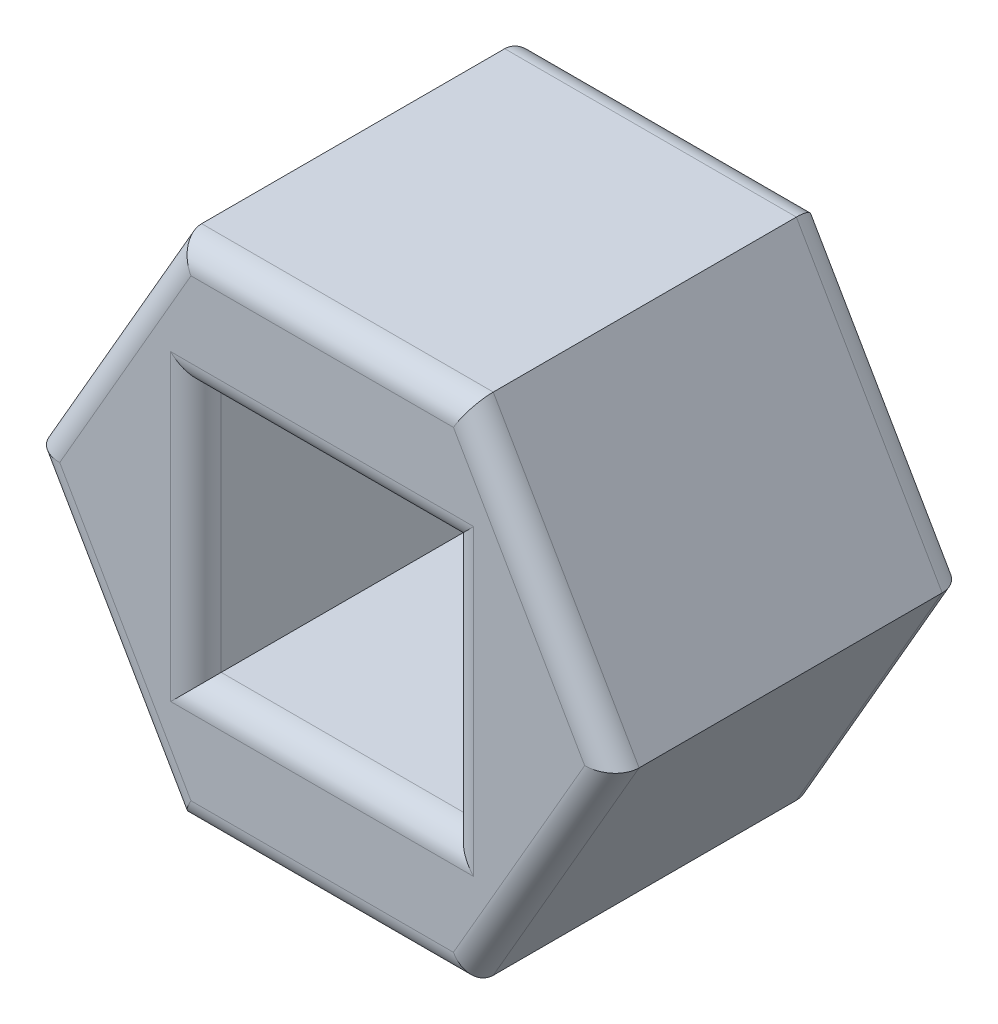
ISO-10303-21;
HEADER;
FILE_DESCRIPTION(('STEP AP214'),'2;1');
FILE_NAME('part.step','',(''),(''),'','','');
FILE_SCHEMA(('AUTOMOTIVE_DESIGN { 1 0 10303 214 1 1 1 1 }'));
ENDSEC;
DATA;
#1=APPLICATION_CONTEXT('core data for automotive mechanical design processes');
#2=APPLICATION_PROTOCOL_DEFINITION('international standard','automotive_design',2000,#1);
#3=PRODUCT_CONTEXT('',#1,'mechanical');
#4=PRODUCT('Part','Part','',(#3));
#5=PRODUCT_RELATED_PRODUCT_CATEGORY('part','',(#4));
#6=PRODUCT_DEFINITION_FORMATION('','',#4);
#7=PRODUCT_DEFINITION_CONTEXT('part definition',#1,'design');
#8=PRODUCT_DEFINITION('design','',#6,#7);
#9=PRODUCT_DEFINITION_SHAPE('','',#8);
#10=(LENGTH_UNIT() NAMED_UNIT(*) SI_UNIT(.MILLI.,.METRE.));
#11=(NAMED_UNIT(*) PLANE_ANGLE_UNIT() SI_UNIT($,.RADIAN.));
#12=(NAMED_UNIT(*) SI_UNIT($,.STERADIAN.) SOLID_ANGLE_UNIT());
#13=UNCERTAINTY_MEASURE_WITH_UNIT(LENGTH_MEASURE(1.E-05),#10,'distance_accuracy_value','');
#14=(GEOMETRIC_REPRESENTATION_CONTEXT(3) GLOBAL_UNCERTAINTY_ASSIGNED_CONTEXT((#13)) GLOBAL_UNIT_ASSIGNED_CONTEXT((#10,
#11,#12)) REPRESENTATION_CONTEXT('',''));
#15=CARTESIAN_POINT('',(0.,0.,0.));
#16=DIRECTION('',(0.,0.,1.));
#17=DIRECTION('',(1.,0.,0.));
#18=AXIS2_PLACEMENT_3D('',#15,#16,#17);
#19=CARTESIAN_POINT('',(0.,0.,8.89));
#20=DIRECTION('',(0.,0.,1.));
#21=DIRECTION('',(1.,0.,0.));
#22=AXIS2_PLACEMENT_3D('',#19,#20,#21);
#23=PLANE('',#22);
#24=DIRECTION('',(1.,0.,0.));
#25=VECTOR('',#24,1.);
#26=CARTESIAN_POINT('',(0.,-3.81,8.89));
#27=LINE('',#26,#25);
#28=CARTESIAN_POINT('',(3.81,-3.81,8.89));
#29=VERTEX_POINT('',#28);
#30=CARTESIAN_POINT('',(-3.81,-3.81,8.89));
#31=VERTEX_POINT('',#30);
#32=EDGE_CURVE('E46',#29,#31,#27,.F.);
#33=ORIENTED_EDGE('',*,*,#32,.T.);
#34=DIRECTION('',(0.,-1.,0.));
#35=VECTOR('',#34,1.);
#36=CARTESIAN_POINT('',(-3.81,0.,8.89));
#37=LINE('',#36,#35);
#38=CARTESIAN_POINT('',(-3.81,3.81,8.89));
#39=VERTEX_POINT('',#38);
#40=EDGE_CURVE('E11',#31,#39,#37,.F.);
#41=ORIENTED_EDGE('',*,*,#40,.T.);
#42=DIRECTION('',(-1.,0.,0.));
#43=VECTOR('',#42,1.);
#44=CARTESIAN_POINT('',(0.,3.81,8.89));
#45=LINE('',#44,#43);
#46=CARTESIAN_POINT('',(3.81,3.81,8.89));
#47=VERTEX_POINT('',#46);
#48=EDGE_CURVE('E270',#39,#47,#45,.F.);
#49=ORIENTED_EDGE('',*,*,#48,.T.);
#50=DIRECTION('',(0.,1.,0.));
#51=VECTOR('',#50,1.);
#52=CARTESIAN_POINT('',(3.81,0.,8.89));
#53=LINE('',#52,#51);
#54=EDGE_CURVE('E57',#47,#29,#53,.F.);
#55=ORIENTED_EDGE('',*,*,#54,.T.);
#56=EDGE_LOOP('',(#33,#41,#49,#55));
#57=FACE_BOUND('',#56,.T.);
#58=DIRECTION('',(0.5,-0.866025403784439,0.));
#59=VECTOR('',#58,1.);
#60=CARTESIAN_POINT('',(-3.116248077951,-6.0325,8.89));
#61=LINE('',#60,#59);
#62=CARTESIAN_POINT('',(-6.59911357683742,0.,8.89));
#63=VERTEX_POINT('',#62);
#64=CARTESIAN_POINT('',(-3.29955678841871,-5.715,8.89));
#65=VERTEX_POINT('',#64);
#66=EDGE_CURVE('E265',#63,#65,#61,.T.);
#67=ORIENTED_EDGE('',*,*,#66,.T.);
#68=DIRECTION('',(1.,0.,0.));
#69=VECTOR('',#68,1.);
#70=CARTESIAN_POINT('',(3.66617420935413,-5.715,8.89));
#71=LINE('',#70,#69);
#72=CARTESIAN_POINT('',(3.29955678841871,-5.715,8.89));
#73=VERTEX_POINT('',#72);
#74=EDGE_CURVE('E267',#65,#73,#71,.T.);
#75=ORIENTED_EDGE('',*,*,#74,.T.);
#76=DIRECTION('',(0.5,0.866025403784439,0.));
#77=VECTOR('',#76,1.);
#78=CARTESIAN_POINT('',(6.78242228730513,0.317499999999998,8.89));
#79=LINE('',#78,#77);
#80=CARTESIAN_POINT('',(6.59911357683742,0.,8.89));
#81=VERTEX_POINT('',#80);
#82=EDGE_CURVE('E257',#73,#81,#79,.T.);
#83=ORIENTED_EDGE('',*,*,#82,.T.);
#84=DIRECTION('',(-0.5,0.866025403784439,0.));
#85=VECTOR('',#84,1.);
#86=CARTESIAN_POINT('',(3.116248077951,6.0325,8.89));
#87=LINE('',#86,#85);
#88=CARTESIAN_POINT('',(3.29955678841871,5.715,8.89));
#89=VERTEX_POINT('',#88);
#90=EDGE_CURVE('E259',#81,#89,#87,.T.);
#91=ORIENTED_EDGE('',*,*,#90,.T.);
#92=DIRECTION('',(-1.,0.,0.));
#93=VECTOR('',#92,1.);
#94=CARTESIAN_POINT('',(-3.66617420935412,5.715,8.89));
#95=LINE('',#94,#93);
#96=CARTESIAN_POINT('',(-3.29955678841871,5.715,8.89));
#97=VERTEX_POINT('',#96);
#98=EDGE_CURVE('E261',#89,#97,#95,.T.);
#99=ORIENTED_EDGE('',*,*,#98,.T.);
#100=DIRECTION('',(-0.5,-0.866025403784439,0.));
#101=VECTOR('',#100,1.);
#102=CARTESIAN_POINT('',(-6.78242228730513,-0.3175,8.89));
#103=LINE('',#102,#101);
#104=EDGE_CURVE('E263',#97,#63,#103,.T.);
#105=ORIENTED_EDGE('',*,*,#104,.T.);
#106=EDGE_LOOP('',(#67,#75,#83,#91,#99,#105));
#107=FACE_BOUND('',#106,.T.);
#108=ADVANCED_FACE('F37',(#57,#107),#23,.T.);
#109=CARTESIAN_POINT('',(0.,0.,0.));
#110=DIRECTION('',(0.,0.,1.));
#111=DIRECTION('',(1.,0.,0.));
#112=AXIS2_PLACEMENT_3D('',#109,#110,#111);
#113=PLANE('',#112);
#114=DIRECTION('',(0.,-1.,0.));
#115=VECTOR('',#114,1.);
#116=CARTESIAN_POINT('',(-3.81,-3.175,0.));
#117=LINE('',#116,#115);
#118=CARTESIAN_POINT('',(-3.81,3.81,0.));
#119=VERTEX_POINT('',#118);
#120=CARTESIAN_POINT('',(-3.81,-3.81,0.));
#121=VERTEX_POINT('',#120);
#122=EDGE_CURVE('E210',#119,#121,#117,.T.);
#123=ORIENTED_EDGE('',*,*,#122,.T.);
#124=DIRECTION('',(1.,0.,0.));
#125=VECTOR('',#124,1.);
#126=CARTESIAN_POINT('',(3.175,-3.81,0.));
#127=LINE('',#126,#125);
#128=CARTESIAN_POINT('',(3.81,-3.81,0.));
#129=VERTEX_POINT('',#128);
#130=EDGE_CURVE('E212',#121,#129,#127,.T.);
#131=ORIENTED_EDGE('',*,*,#130,.T.);
#132=DIRECTION('',(0.,1.,0.));
#133=VECTOR('',#132,1.);
#134=CARTESIAN_POINT('',(3.81,3.175,0.));
#135=LINE('',#134,#133);
#136=CARTESIAN_POINT('',(3.81,3.81,0.));
#137=VERTEX_POINT('',#136);
#138=EDGE_CURVE('E201',#129,#137,#135,.T.);
#139=ORIENTED_EDGE('',*,*,#138,.T.);
#140=DIRECTION('',(-1.,0.,0.));
#141=VECTOR('',#140,1.);
#142=CARTESIAN_POINT('',(-3.175,3.81,0.));
#143=LINE('',#142,#141);
#144=EDGE_CURVE('E203',#137,#119,#143,.T.);
#145=ORIENTED_EDGE('',*,*,#144,.T.);
#146=EDGE_LOOP('',(#123,#131,#139,#145));
#147=FACE_BOUND('',#146,.T.);
#148=DIRECTION('',(-1.,0.,0.));
#149=VECTOR('',#148,1.);
#150=CARTESIAN_POINT('',(0.,5.715,0.));
#151=LINE('',#150,#149);
#152=CARTESIAN_POINT('',(-3.29955678841871,5.715,0.));
#153=VERTEX_POINT('',#152);
#154=CARTESIAN_POINT('',(3.29955678841871,5.715,0.));
#155=VERTEX_POINT('',#154);
#156=EDGE_CURVE('E200',#153,#155,#151,.F.);
#157=ORIENTED_EDGE('',*,*,#156,.T.);
#158=DIRECTION('',(-0.5,0.866025403784439,0.));
#159=VECTOR('',#158,1.);
#160=CARTESIAN_POINT('',(4.94933518262806,2.8575,0.));
#161=LINE('',#160,#159);
#162=CARTESIAN_POINT('',(6.59911357683742,0.,0.));
#163=VERTEX_POINT('',#162);
#164=EDGE_CURVE('E179',#155,#163,#161,.F.);
#165=ORIENTED_EDGE('',*,*,#164,.T.);
#166=DIRECTION('',(0.5,0.866025403784439,0.));
#167=VECTOR('',#166,1.);
#168=CARTESIAN_POINT('',(4.94933518262807,-2.8575,0.));
#169=LINE('',#168,#167);
#170=CARTESIAN_POINT('',(3.29955678841872,-5.715,0.));
#171=VERTEX_POINT('',#170);
#172=EDGE_CURVE('E189',#163,#171,#169,.F.);
#173=ORIENTED_EDGE('',*,*,#172,.T.);
#174=DIRECTION('',(1.,0.,0.));
#175=VECTOR('',#174,1.);
#176=CARTESIAN_POINT('',(0.,-5.715,0.));
#177=LINE('',#176,#175);
#178=CARTESIAN_POINT('',(-3.29955678841871,-5.715,0.));
#179=VERTEX_POINT('',#178);
#180=EDGE_CURVE('E195',#171,#179,#177,.F.);
#181=ORIENTED_EDGE('',*,*,#180,.T.);
#182=DIRECTION('',(0.5,-0.866025403784439,0.));
#183=VECTOR('',#182,1.);
#184=CARTESIAN_POINT('',(-4.94933518262806,-2.8575,0.));
#185=LINE('',#184,#183);
#186=CARTESIAN_POINT('',(-6.59911357683742,0.,0.));
#187=VERTEX_POINT('',#186);
#188=EDGE_CURVE('E349',#179,#187,#185,.F.);
#189=ORIENTED_EDGE('',*,*,#188,.T.);
#190=DIRECTION('',(-0.5,-0.866025403784439,0.));
#191=VECTOR('',#190,1.);
#192=CARTESIAN_POINT('',(-4.94933518262807,2.8575,0.));
#193=LINE('',#192,#191);
#194=EDGE_CURVE('E205',#187,#153,#193,.F.);
#195=ORIENTED_EDGE('',*,*,#194,.T.);
#196=EDGE_LOOP('',(#157,#165,#173,#181,#189,#195));
#197=FACE_BOUND('',#196,.T.);
#198=ADVANCED_FACE('F198',(#147,#197),#113,.F.);
#199=CARTESIAN_POINT('',(3.66617420935413,-6.35,8.89));
#200=DIRECTION('',(-0.866025403784439,0.5,0.));
#201=DIRECTION('',(-0.5,-0.866025403784439,0.));
#202=AXIS2_PLACEMENT_3D('',#199,#200,#201);
#203=PLANE('',#202);
#204=DIRECTION('',(0.,0.,-1.));
#205=VECTOR('',#204,1.);
#206=CARTESIAN_POINT('',(3.66617420935413,-6.35,8.89));
#207=LINE('',#206,#205);
#208=CARTESIAN_POINT('',(3.66617420935413,-6.35,8.255));
#209=VERTEX_POINT('',#208);
#210=CARTESIAN_POINT('',(3.66617420935413,-6.35,0.635));
#211=VERTEX_POINT('',#210);
#212=EDGE_CURVE('E368',#209,#211,#207,.T.);
#213=ORIENTED_EDGE('',*,*,#212,.T.);
#214=DIRECTION('',(0.5,0.866025403784439,0.));
#215=VECTOR('',#214,1.);
#216=CARTESIAN_POINT('',(3.66617420935413,-6.35,0.635));
#217=LINE('',#216,#215);
#218=CARTESIAN_POINT('',(7.33234841870825,0.,0.635));
#219=VERTEX_POINT('',#218);
#220=EDGE_CURVE('E255',#211,#219,#217,.T.);
#221=ORIENTED_EDGE('',*,*,#220,.T.);
#222=DIRECTION('',(0.,0.,-1.));
#223=VECTOR('',#222,1.);
#224=CARTESIAN_POINT('',(7.33234841870825,0.,8.89));
#225=LINE('',#224,#223);
#226=CARTESIAN_POINT('',(7.33234841870825,0.,8.255));
#227=VERTEX_POINT('',#226);
#228=EDGE_CURVE('E196',#227,#219,#225,.T.);
#229=ORIENTED_EDGE('',*,*,#228,.F.);
#230=DIRECTION('',(0.5,0.866025403784439,0.));
#231=VECTOR('',#230,1.);
#232=CARTESIAN_POINT('',(3.66617420935413,-6.35,8.255));
#233=LINE('',#232,#231);
#234=EDGE_CURVE('E253',#227,#209,#233,.F.);
#235=ORIENTED_EDGE('',*,*,#234,.T.);
#236=EDGE_LOOP('',(#213,#221,#229,#235));
#237=FACE_BOUND('',#236,.T.);
#238=ADVANCED_FACE('F433',(#237),#203,.F.);
#239=CARTESIAN_POINT('',(7.33234841870825,0.,8.89));
#240=DIRECTION('',(-0.866025403784438,-0.5,0.));
#241=DIRECTION('',(0.5,-0.866025403784439,0.));
#242=AXIS2_PLACEMENT_3D('',#239,#240,#241);
#243=PLANE('',#242);
#244=ORIENTED_EDGE('',*,*,#228,.T.);
#245=DIRECTION('',(-0.5,0.866025403784439,0.));
#246=VECTOR('',#245,1.);
#247=CARTESIAN_POINT('',(7.33234841870825,0.,0.635));
#248=LINE('',#247,#246);
#249=CARTESIAN_POINT('',(3.66617420935412,6.35,0.635));
#250=VERTEX_POINT('',#249);
#251=EDGE_CURVE('E182',#219,#250,#248,.T.);
#252=ORIENTED_EDGE('',*,*,#251,.T.);
#253=DIRECTION('',(0.,0.,-1.));
#254=VECTOR('',#253,1.);
#255=CARTESIAN_POINT('',(3.66617420935412,6.35,8.89));
#256=LINE('',#255,#254);
#257=CARTESIAN_POINT('',(3.66617420935412,6.35,8.255));
#258=VERTEX_POINT('',#257);
#259=EDGE_CURVE('E335',#258,#250,#256,.T.);
#260=ORIENTED_EDGE('',*,*,#259,.F.);
#261=DIRECTION('',(-0.5,0.866025403784439,0.));
#262=VECTOR('',#261,1.);
#263=CARTESIAN_POINT('',(7.33234841870825,0.,8.255));
#264=LINE('',#263,#262);
#265=EDGE_CURVE('E233',#258,#227,#264,.F.);
#266=ORIENTED_EDGE('',*,*,#265,.T.);
#267=EDGE_LOOP('',(#244,#252,#260,#266));
#268=FACE_BOUND('',#267,.T.);
#269=ADVANCED_FACE('F340',(#268),#243,.F.);
#270=CARTESIAN_POINT('',(3.66617420935412,6.35,8.89));
#271=DIRECTION('',(0.,-1.,0.));
#272=DIRECTION('',(0.,0.,-1.));
#273=AXIS2_PLACEMENT_3D('',#270,#271,#272);
#274=PLANE('',#273);
#275=ORIENTED_EDGE('',*,*,#259,.T.);
#276=DIRECTION('',(-1.,0.,0.));
#277=VECTOR('',#276,1.);
#278=CARTESIAN_POINT('',(3.66617420935412,6.35,0.635));
#279=LINE('',#278,#277);
#280=CARTESIAN_POINT('',(-3.66617420935412,6.35,0.635));
#281=VERTEX_POINT('',#280);
#282=EDGE_CURVE('E238',#250,#281,#279,.T.);
#283=ORIENTED_EDGE('',*,*,#282,.T.);
#284=DIRECTION('',(0.,0.,-1.));
#285=VECTOR('',#284,1.);
#286=CARTESIAN_POINT('',(-3.66617420935412,6.35,8.89));
#287=LINE('',#286,#285);
#288=CARTESIAN_POINT('',(-3.66617420935412,6.35,8.255));
#289=VERTEX_POINT('',#288);
#290=EDGE_CURVE('E337',#289,#281,#287,.T.);
#291=ORIENTED_EDGE('',*,*,#290,.F.);
#292=DIRECTION('',(-1.,0.,0.));
#293=VECTOR('',#292,1.);
#294=CARTESIAN_POINT('',(3.66617420935412,6.35,8.255));
#295=LINE('',#294,#293);
#296=EDGE_CURVE('E236',#289,#258,#295,.F.);
#297=ORIENTED_EDGE('',*,*,#296,.T.);
#298=EDGE_LOOP('',(#275,#283,#291,#297));
#299=FACE_BOUND('',#298,.T.);
#300=ADVANCED_FACE('F334',(#299),#274,.F.);
#301=CARTESIAN_POINT('',(-3.66617420935412,6.35,8.89));
#302=DIRECTION('',(0.866025403784439,-0.5,0.));
#303=DIRECTION('',(0.5,0.866025403784439,0.));
#304=AXIS2_PLACEMENT_3D('',#301,#302,#303);
#305=PLANE('',#304);
#306=ORIENTED_EDGE('',*,*,#290,.T.);
#307=DIRECTION('',(-0.5,-0.866025403784439,0.));
#308=VECTOR('',#307,1.);
#309=CARTESIAN_POINT('',(-3.66617420935412,6.35,0.635));
#310=LINE('',#309,#308);
#311=CARTESIAN_POINT('',(-7.33234841870825,0.,0.635));
#312=VERTEX_POINT('',#311);
#313=EDGE_CURVE('E242',#281,#312,#310,.T.);
#314=ORIENTED_EDGE('',*,*,#313,.T.);
#315=DIRECTION('',(0.,0.,-1.));
#316=VECTOR('',#315,1.);
#317=CARTESIAN_POINT('',(-7.33234841870825,0.,8.89));
#318=LINE('',#317,#316);
#319=CARTESIAN_POINT('',(-7.33234841870825,0.,8.255));
#320=VERTEX_POINT('',#319);
#321=EDGE_CURVE('E344',#320,#312,#318,.T.);
#322=ORIENTED_EDGE('',*,*,#321,.F.);
#323=DIRECTION('',(-0.5,-0.866025403784439,0.));
#324=VECTOR('',#323,1.);
#325=CARTESIAN_POINT('',(-3.66617420935412,6.35,8.255));
#326=LINE('',#325,#324);
#327=EDGE_CURVE('E240',#320,#289,#326,.F.);
#328=ORIENTED_EDGE('',*,*,#327,.T.);
#329=EDGE_LOOP('',(#306,#314,#322,#328));
#330=FACE_BOUND('',#329,.T.);
#331=ADVANCED_FACE('F361',(#330),#305,.F.);
#332=CARTESIAN_POINT('',(-7.33234841870825,0.,8.89));
#333=DIRECTION('',(0.866025403784439,0.5,0.));
#334=DIRECTION('',(-0.5,0.866025403784439,0.));
#335=AXIS2_PLACEMENT_3D('',#332,#333,#334);
#336=PLANE('',#335);
#337=ORIENTED_EDGE('',*,*,#321,.T.);
#338=DIRECTION('',(0.5,-0.866025403784439,0.));
#339=VECTOR('',#338,1.);
#340=CARTESIAN_POINT('',(-7.33234841870825,0.,0.635));
#341=LINE('',#340,#339);
#342=CARTESIAN_POINT('',(-3.66617420935412,-6.35,0.635));
#343=VERTEX_POINT('',#342);
#344=EDGE_CURVE('E246',#312,#343,#341,.T.);
#345=ORIENTED_EDGE('',*,*,#344,.T.);
#346=DIRECTION('',(0.,0.,-1.));
#347=VECTOR('',#346,1.);
#348=CARTESIAN_POINT('',(-3.66617420935412,-6.35,8.89));
#349=LINE('',#348,#347);
#350=CARTESIAN_POINT('',(-3.66617420935412,-6.35,8.255));
#351=VERTEX_POINT('',#350);
#352=EDGE_CURVE('E366',#351,#343,#349,.T.);
#353=ORIENTED_EDGE('',*,*,#352,.F.);
#354=DIRECTION('',(0.5,-0.866025403784439,0.));
#355=VECTOR('',#354,1.);
#356=CARTESIAN_POINT('',(-7.33234841870825,0.,8.255));
#357=LINE('',#356,#355);
#358=EDGE_CURVE('E244',#351,#320,#357,.F.);
#359=ORIENTED_EDGE('',*,*,#358,.T.);
#360=EDGE_LOOP('',(#337,#345,#353,#359));
#361=FACE_BOUND('',#360,.T.);
#362=ADVANCED_FACE('F443',(#361),#336,.F.);
#363=CARTESIAN_POINT('',(-3.66617420935412,-6.35,8.89));
#364=DIRECTION('',(0.,1.,0.));
#365=DIRECTION('',(-1.,0.,0.));
#366=AXIS2_PLACEMENT_3D('',#363,#364,#365);
#367=PLANE('',#366);
#368=ORIENTED_EDGE('',*,*,#352,.T.);
#369=DIRECTION('',(1.,0.,0.));
#370=VECTOR('',#369,1.);
#371=CARTESIAN_POINT('',(-3.66617420935412,-6.35,0.635));
#372=LINE('',#371,#370);
#373=EDGE_CURVE('E251',#343,#211,#372,.T.);
#374=ORIENTED_EDGE('',*,*,#373,.T.);
#375=ORIENTED_EDGE('',*,*,#212,.F.);
#376=DIRECTION('',(1.,0.,0.));
#377=VECTOR('',#376,1.);
#378=CARTESIAN_POINT('',(-3.66617420935412,-6.35,8.255));
#379=LINE('',#378,#377);
#380=EDGE_CURVE('E248',#209,#351,#379,.F.);
#381=ORIENTED_EDGE('',*,*,#380,.T.);
#382=EDGE_LOOP('',(#368,#374,#375,#381));
#383=FACE_BOUND('',#382,.T.);
#384=ADVANCED_FACE('F440',(#383),#367,.F.);
#385=CARTESIAN_POINT('',(3.175,-3.175,8.89));
#386=DIRECTION('',(-1.,0.,0.));
#387=DIRECTION('',(0.,0.,1.));
#388=AXIS2_PLACEMENT_3D('',#385,#386,#387);
#389=PLANE('',#388);
#390=DIRECTION('',(0.,0.,-1.));
#391=VECTOR('',#390,1.);
#392=CARTESIAN_POINT('',(3.175,3.175,8.89));
#393=LINE('',#392,#391);
#394=CARTESIAN_POINT('',(3.175,3.175,8.255));
#395=VERTEX_POINT('',#394);
#396=CARTESIAN_POINT('',(3.175,3.175,0.635));
#397=VERTEX_POINT('',#396);
#398=EDGE_CURVE('E373',#395,#397,#393,.T.);
#399=ORIENTED_EDGE('',*,*,#398,.T.);
#400=DIRECTION('',(0.,1.,0.));
#401=VECTOR('',#400,1.);
#402=CARTESIAN_POINT('',(3.175,-3.175,0.635));
#403=LINE('',#402,#401);
#404=CARTESIAN_POINT('',(3.175,-3.175,0.635));
#405=VERTEX_POINT('',#404);
#406=EDGE_CURVE('E231',#397,#405,#403,.F.);
#407=ORIENTED_EDGE('',*,*,#406,.T.);
#408=DIRECTION('',(0.,0.,-1.));
#409=VECTOR('',#408,1.);
#410=CARTESIAN_POINT('',(3.175,-3.175,8.89));
#411=LINE('',#410,#409);
#412=CARTESIAN_POINT('',(3.175,-3.175,8.255));
#413=VERTEX_POINT('',#412);
#414=EDGE_CURVE('E285',#413,#405,#411,.T.);
#415=ORIENTED_EDGE('',*,*,#414,.F.);
#416=DIRECTION('',(0.,1.,0.));
#417=VECTOR('',#416,1.);
#418=CARTESIAN_POINT('',(3.175,-3.175,8.255));
#419=LINE('',#418,#417);
#420=EDGE_CURVE('E229',#413,#395,#419,.T.);
#421=ORIENTED_EDGE('',*,*,#420,.T.);
#422=EDGE_LOOP('',(#399,#407,#415,#421));
#423=FACE_BOUND('',#422,.T.);
#424=ADVANCED_FACE('F437',(#423),#389,.T.);
#425=CARTESIAN_POINT('',(-3.175,3.175,8.89));
#426=DIRECTION('',(0.,-1.,0.));
#427=DIRECTION('',(0.,0.,-1.));
#428=AXIS2_PLACEMENT_3D('',#425,#426,#427);
#429=PLANE('',#428);
#430=DIRECTION('',(0.,0.,-1.));
#431=VECTOR('',#430,1.);
#432=CARTESIAN_POINT('',(-3.175,3.175,8.89));
#433=LINE('',#432,#431);
#434=CARTESIAN_POINT('',(-3.175,3.175,8.255));
#435=VERTEX_POINT('',#434);
#436=CARTESIAN_POINT('',(-3.175,3.175,0.635));
#437=VERTEX_POINT('',#436);
#438=EDGE_CURVE('E376',#435,#437,#433,.T.);
#439=ORIENTED_EDGE('',*,*,#438,.T.);
#440=DIRECTION('',(-1.,0.,0.));
#441=VECTOR('',#440,1.);
#442=CARTESIAN_POINT('',(3.175,3.175,0.635));
#443=LINE('',#442,#441);
#444=EDGE_CURVE('E227',#437,#397,#443,.F.);
#445=ORIENTED_EDGE('',*,*,#444,.T.);
#446=ORIENTED_EDGE('',*,*,#398,.F.);
#447=DIRECTION('',(-1.,0.,0.));
#448=VECTOR('',#447,1.);
#449=CARTESIAN_POINT('',(-3.175,3.175,8.255));
#450=LINE('',#449,#448);
#451=EDGE_CURVE('E225',#395,#435,#450,.T.);
#452=ORIENTED_EDGE('',*,*,#451,.T.);
#453=EDGE_LOOP('',(#439,#445,#446,#452));
#454=FACE_BOUND('',#453,.T.);
#455=ADVANCED_FACE('F414',(#454),#429,.T.);
#456=CARTESIAN_POINT('',(-3.175,-3.175,8.89));
#457=DIRECTION('',(1.,0.,0.));
#458=DIRECTION('',(0.,0.,-1.));
#459=AXIS2_PLACEMENT_3D('',#456,#457,#458);
#460=PLANE('',#459);
#461=DIRECTION('',(0.,0.,-1.));
#462=VECTOR('',#461,1.);
#463=CARTESIAN_POINT('',(-3.175,-3.175,8.89));
#464=LINE('',#463,#462);
#465=CARTESIAN_POINT('',(-3.175,-3.175,8.255));
#466=VERTEX_POINT('',#465);
#467=CARTESIAN_POINT('',(-3.175,-3.175,0.635));
#468=VERTEX_POINT('',#467);
#469=EDGE_CURVE('E379',#466,#468,#464,.T.);
#470=ORIENTED_EDGE('',*,*,#469,.T.);
#471=DIRECTION('',(0.,-1.,0.));
#472=VECTOR('',#471,1.);
#473=CARTESIAN_POINT('',(-3.175,3.175,0.635));
#474=LINE('',#473,#472);
#475=EDGE_CURVE('E223',#468,#437,#474,.F.);
#476=ORIENTED_EDGE('',*,*,#475,.T.);
#477=ORIENTED_EDGE('',*,*,#438,.F.);
#478=DIRECTION('',(0.,-1.,0.));
#479=VECTOR('',#478,1.);
#480=CARTESIAN_POINT('',(-3.175,-3.175,8.255));
#481=LINE('',#480,#479);
#482=EDGE_CURVE('E220',#435,#466,#481,.T.);
#483=ORIENTED_EDGE('',*,*,#482,.T.);
#484=EDGE_LOOP('',(#470,#476,#477,#483));
#485=FACE_BOUND('',#484,.T.);
#486=ADVANCED_FACE('F410',(#485),#460,.T.);
#487=CARTESIAN_POINT('',(-3.175,-3.175,8.89));
#488=DIRECTION('',(0.,1.,0.));
#489=DIRECTION('',(0.,0.,1.));
#490=AXIS2_PLACEMENT_3D('',#487,#488,#489);
#491=PLANE('',#490);
#492=ORIENTED_EDGE('',*,*,#414,.T.);
#493=DIRECTION('',(1.,0.,0.));
#494=VECTOR('',#493,1.);
#495=CARTESIAN_POINT('',(-3.175,-3.175,0.635));
#496=LINE('',#495,#494);
#497=EDGE_CURVE('E217',#405,#468,#496,.F.);
#498=ORIENTED_EDGE('',*,*,#497,.T.);
#499=ORIENTED_EDGE('',*,*,#469,.F.);
#500=DIRECTION('',(1.,0.,0.));
#501=VECTOR('',#500,1.);
#502=CARTESIAN_POINT('',(-3.175,-3.175,8.255));
#503=LINE('',#502,#501);
#504=EDGE_CURVE('E215',#466,#413,#503,.T.);
#505=ORIENTED_EDGE('',*,*,#504,.T.);
#506=EDGE_LOOP('',(#492,#498,#499,#505));
#507=FACE_BOUND('',#506,.T.);
#508=ADVANCED_FACE('F386',(#507),#491,.T.);
#509=CARTESIAN_POINT('',(0.,3.81,0.635));
#510=DIRECTION('',(1.,0.,0.));
#511=DIRECTION('',(0.,0.,-1.));
#512=AXIS2_PLACEMENT_3D('',#509,#510,#511);
#513=CYLINDRICAL_SURFACE('',#512,0.635);
#514=CARTESIAN_POINT('',(3.81,3.81,0.635));
#515=DIRECTION('',(0.707106781186547,-0.707106781186547,0.));
#516=DIRECTION('',(0.707106781186547,0.707106781186547,0.));
#517=AXIS2_PLACEMENT_3D('',#514,#515,#516);
#518=ELLIPSE('',#517,0.898025612106915,0.635);
#519=EDGE_CURVE('E279',#397,#137,#518,.T.);
#520=ORIENTED_EDGE('',*,*,#519,.F.);
#521=ORIENTED_EDGE('',*,*,#444,.F.);
#522=CARTESIAN_POINT('',(-3.81,3.81,0.635));
#523=DIRECTION('',(0.707106781186547,0.707106781186547,0.));
#524=DIRECTION('',(-0.707106781186547,0.707106781186547,0.));
#525=AXIS2_PLACEMENT_3D('',#522,#523,#524);
#526=ELLIPSE('',#525,0.898025612106915,0.635);
#527=EDGE_CURVE('E282',#119,#437,#526,.F.);
#528=ORIENTED_EDGE('',*,*,#527,.F.);
#529=ORIENTED_EDGE('',*,*,#144,.F.);
#530=EDGE_LOOP('',(#520,#521,#528,#529));
#531=FACE_BOUND('',#530,.T.);
#532=ADVANCED_FACE('F418',(#531),#513,.T.);
#533=CARTESIAN_POINT('',(-3.81,0.,0.635));
#534=DIRECTION('',(0.,1.,0.));
#535=DIRECTION('',(0.,0.,1.));
#536=AXIS2_PLACEMENT_3D('',#533,#534,#535);
#537=CYLINDRICAL_SURFACE('',#536,0.635);
#538=ORIENTED_EDGE('',*,*,#527,.T.);
#539=ORIENTED_EDGE('',*,*,#475,.F.);
#540=CARTESIAN_POINT('',(-3.81,-3.81,0.635));
#541=DIRECTION('',(-0.707106781186547,0.707106781186547,0.));
#542=DIRECTION('',(-0.707106781186547,-0.707106781186547,0.));
#543=AXIS2_PLACEMENT_3D('',#540,#541,#542);
#544=ELLIPSE('',#543,0.898025612106915,0.635);
#545=EDGE_CURVE('E276',#121,#468,#544,.F.);
#546=ORIENTED_EDGE('',*,*,#545,.F.);
#547=ORIENTED_EDGE('',*,*,#122,.F.);
#548=EDGE_LOOP('',(#538,#539,#546,#547));
#549=FACE_BOUND('',#548,.T.);
#550=ADVANCED_FACE('F407',(#549),#537,.T.);
#551=CARTESIAN_POINT('',(3.81,0.,0.635));
#552=DIRECTION('',(0.,-1.,0.));
#553=DIRECTION('',(0.,0.,-1.));
#554=AXIS2_PLACEMENT_3D('',#551,#552,#553);
#555=CYLINDRICAL_SURFACE('',#554,0.635);
#556=ORIENTED_EDGE('',*,*,#519,.T.);
#557=ORIENTED_EDGE('',*,*,#138,.F.);
#558=CARTESIAN_POINT('',(3.81,-3.81,0.635));
#559=DIRECTION('',(-0.707106781186547,-0.707106781186547,0.));
#560=DIRECTION('',(-0.707106781186547,0.707106781186547,0.));
#561=AXIS2_PLACEMENT_3D('',#558,#559,#560);
#562=ELLIPSE('',#561,0.898025612106915,0.635);
#563=EDGE_CURVE('E274',#405,#129,#562,.T.);
#564=ORIENTED_EDGE('',*,*,#563,.F.);
#565=ORIENTED_EDGE('',*,*,#406,.F.);
#566=EDGE_LOOP('',(#556,#557,#564,#565));
#567=FACE_BOUND('',#566,.T.);
#568=ADVANCED_FACE('F400',(#567),#555,.T.);
#569=CARTESIAN_POINT('',(0.,-3.81,0.635));
#570=DIRECTION('',(-1.,0.,0.));
#571=DIRECTION('',(0.,0.,1.));
#572=AXIS2_PLACEMENT_3D('',#569,#570,#571);
#573=CYLINDRICAL_SURFACE('',#572,0.635);
#574=ORIENTED_EDGE('',*,*,#545,.T.);
#575=ORIENTED_EDGE('',*,*,#497,.F.);
#576=ORIENTED_EDGE('',*,*,#563,.T.);
#577=ORIENTED_EDGE('',*,*,#130,.F.);
#578=EDGE_LOOP('',(#574,#575,#576,#577));
#579=FACE_BOUND('',#578,.T.);
#580=ADVANCED_FACE('F393',(#579),#573,.T.);
#581=CARTESIAN_POINT('',(-6.78242228730513,0.317500000000001,0.635));
#582=DIRECTION('',(0.5,-0.866025403784439,0.));
#583=DIRECTION('',(0.866025403784439,0.5,0.));
#584=AXIS2_PLACEMENT_3D('',#581,#582,#583);
#585=CYLINDRICAL_SURFACE('',#584,0.635);
#586=CARTESIAN_POINT('',(-6.59911357683742,0.,0.635));
#587=DIRECTION('',(0.,-1.,0.));
#588=DIRECTION('',(1.,0.,0.));
#589=AXIS2_PLACEMENT_3D('',#586,#587,#588);
#590=ELLIPSE('',#589,0.733234841870825,0.635);
#591=EDGE_CURVE('E291',#187,#312,#590,.F.);
#592=ORIENTED_EDGE('',*,*,#591,.F.);
#593=ORIENTED_EDGE('',*,*,#188,.F.);
#594=CARTESIAN_POINT('',(-3.29955678841871,-5.715,0.635));
#595=DIRECTION('',(0.866025403784439,-0.5,0.));
#596=DIRECTION('',(0.5,0.866025403784439,0.));
#597=AXIS2_PLACEMENT_3D('',#594,#595,#596);
#598=ELLIPSE('',#597,0.733234841870825,0.635);
#599=EDGE_CURVE('E277',#343,#179,#598,.T.);
#600=ORIENTED_EDGE('',*,*,#599,.F.);
#601=ORIENTED_EDGE('',*,*,#344,.F.);
#602=EDGE_LOOP('',(#592,#593,#600,#601));
#603=FACE_BOUND('',#602,.T.);
#604=ADVANCED_FACE('F458',(#603),#585,.T.);
#605=CARTESIAN_POINT('',(-3.66617420935412,-5.715,0.635));
#606=DIRECTION('',(1.,0.,0.));
#607=DIRECTION('',(0.,1.,0.));
#608=AXIS2_PLACEMENT_3D('',#605,#606,#607);
#609=CYLINDRICAL_SURFACE('',#608,0.635);
#610=ORIENTED_EDGE('',*,*,#599,.T.);
#611=ORIENTED_EDGE('',*,*,#180,.F.);
#612=CARTESIAN_POINT('',(3.29955678841872,-5.715,0.635));
#613=DIRECTION('',(0.866025403784439,0.5,0.));
#614=DIRECTION('',(-0.5,0.866025403784439,0.));
#615=AXIS2_PLACEMENT_3D('',#612,#613,#614);
#616=ELLIPSE('',#615,0.733234841870825,0.635);
#617=EDGE_CURVE('E192',#211,#171,#616,.T.);
#618=ORIENTED_EDGE('',*,*,#617,.F.);
#619=ORIENTED_EDGE('',*,*,#373,.F.);
#620=EDGE_LOOP('',(#610,#611,#618,#619));
#621=FACE_BOUND('',#620,.T.);
#622=ADVANCED_FACE('F474',(#621),#609,.T.);
#623=CARTESIAN_POINT('',(-3.116248077951,6.0325,0.635));
#624=DIRECTION('',(-0.5,-0.866025403784439,0.));
#625=DIRECTION('',(0.866025403784439,-0.5,0.));
#626=AXIS2_PLACEMENT_3D('',#623,#624,#625);
#627=CYLINDRICAL_SURFACE('',#626,0.635);
#628=ORIENTED_EDGE('',*,*,#591,.T.);
#629=ORIENTED_EDGE('',*,*,#313,.F.);
#630=CARTESIAN_POINT('',(-3.29955678841871,5.715,0.635));
#631=DIRECTION('',(-0.866025403784439,-0.5,0.));
#632=DIRECTION('',(0.5,-0.866025403784439,0.));
#633=AXIS2_PLACEMENT_3D('',#630,#631,#632);
#634=ELLIPSE('',#633,0.733234841870825,0.635);
#635=EDGE_CURVE('E185',#153,#281,#634,.F.);
#636=ORIENTED_EDGE('',*,*,#635,.F.);
#637=ORIENTED_EDGE('',*,*,#194,.F.);
#638=EDGE_LOOP('',(#628,#629,#636,#637));
#639=FACE_BOUND('',#638,.T.);
#640=ADVANCED_FACE('F356',(#639),#627,.T.);
#641=CARTESIAN_POINT('',(3.11624807795101,-6.0325,0.635));
#642=DIRECTION('',(0.5,0.866025403784439,0.));
#643=DIRECTION('',(-0.866025403784439,0.5,0.));
#644=AXIS2_PLACEMENT_3D('',#641,#642,#643);
#645=CYLINDRICAL_SURFACE('',#644,0.635);
#646=ORIENTED_EDGE('',*,*,#617,.T.);
#647=ORIENTED_EDGE('',*,*,#172,.F.);
#648=CARTESIAN_POINT('',(6.59911357683742,0.,0.635));
#649=DIRECTION('',(0.,1.,0.));
#650=DIRECTION('',(1.,0.,0.));
#651=AXIS2_PLACEMENT_3D('',#648,#649,#650);
#652=ELLIPSE('',#651,0.733234841870825,0.635);
#653=EDGE_CURVE('E175',#219,#163,#652,.T.);
#654=ORIENTED_EDGE('',*,*,#653,.F.);
#655=ORIENTED_EDGE('',*,*,#220,.F.);
#656=EDGE_LOOP('',(#646,#647,#654,#655));
#657=FACE_BOUND('',#656,.T.);
#658=ADVANCED_FACE('F190',(#657),#645,.T.);
#659=CARTESIAN_POINT('',(3.66617420935412,5.715,0.635));
#660=DIRECTION('',(-1.,0.,0.));
#661=DIRECTION('',(0.,0.,1.));
#662=AXIS2_PLACEMENT_3D('',#659,#660,#661);
#663=CYLINDRICAL_SURFACE('',#662,0.635);
#664=ORIENTED_EDGE('',*,*,#635,.T.);
#665=ORIENTED_EDGE('',*,*,#282,.F.);
#666=CARTESIAN_POINT('',(3.29955678841871,5.715,0.635));
#667=DIRECTION('',(-0.866025403784439,0.5,0.));
#668=DIRECTION('',(-0.5,-0.866025403784439,0.));
#669=AXIS2_PLACEMENT_3D('',#666,#667,#668);
#670=ELLIPSE('',#669,0.733234841870825,0.635);
#671=EDGE_CURVE('E186',#155,#250,#670,.F.);
#672=ORIENTED_EDGE('',*,*,#671,.F.);
#673=ORIENTED_EDGE('',*,*,#156,.F.);
#674=EDGE_LOOP('',(#664,#665,#672,#673));
#675=FACE_BOUND('',#674,.T.);
#676=ADVANCED_FACE('F359',(#675),#663,.T.);
#677=CARTESIAN_POINT('',(6.78242228730513,-0.317500000000004,0.635));
#678=DIRECTION('',(-0.5,0.866025403784439,0.));
#679=DIRECTION('',(-0.866025403784438,-0.5,0.));
#680=AXIS2_PLACEMENT_3D('',#677,#678,#679);
#681=CYLINDRICAL_SURFACE('',#680,0.635);
#682=ORIENTED_EDGE('',*,*,#653,.T.);
#683=ORIENTED_EDGE('',*,*,#164,.F.);
#684=ORIENTED_EDGE('',*,*,#671,.T.);
#685=ORIENTED_EDGE('',*,*,#251,.F.);
#686=EDGE_LOOP('',(#682,#683,#684,#685));
#687=FACE_BOUND('',#686,.T.);
#688=ADVANCED_FACE('F177',(#687),#681,.T.);
#689=CARTESIAN_POINT('',(3.81,-3.175,8.255));
#690=DIRECTION('',(0.,1.,0.));
#691=DIRECTION('',(0.,0.,1.));
#692=AXIS2_PLACEMENT_3D('',#689,#690,#691);
#693=CYLINDRICAL_SURFACE('',#692,0.635);
#694=CARTESIAN_POINT('',(3.81,-3.81,8.255));
#695=DIRECTION('',(0.707106781186547,0.707106781186547,0.));
#696=DIRECTION('',(0.707106781186547,-0.707106781186547,0.));
#697=AXIS2_PLACEMENT_3D('',#694,#695,#696);
#698=ELLIPSE('',#697,0.898025612106915,0.635);
#699=EDGE_CURVE('E300',#29,#413,#698,.F.);
#700=ORIENTED_EDGE('',*,*,#699,.F.);
#701=ORIENTED_EDGE('',*,*,#54,.F.);
#702=CARTESIAN_POINT('',(3.81,3.81,8.255));
#703=DIRECTION('',(-0.707106781186547,0.707106781186547,0.));
#704=DIRECTION('',(0.707106781186547,0.707106781186547,0.));
#705=AXIS2_PLACEMENT_3D('',#702,#703,#704);
#706=ELLIPSE('',#705,0.898025612106915,0.635);
#707=EDGE_CURVE('E286',#395,#47,#706,.T.);
#708=ORIENTED_EDGE('',*,*,#707,.F.);
#709=ORIENTED_EDGE('',*,*,#420,.F.);
#710=EDGE_LOOP('',(#700,#701,#708,#709));
#711=FACE_BOUND('',#710,.T.);
#712=ADVANCED_FACE('F507',(#711),#693,.T.);
#713=CARTESIAN_POINT('',(-3.175,3.81,8.255));
#714=DIRECTION('',(-1.,0.,0.));
#715=DIRECTION('',(0.,0.,1.));
#716=AXIS2_PLACEMENT_3D('',#713,#714,#715);
#717=CYLINDRICAL_SURFACE('',#716,0.635);
#718=ORIENTED_EDGE('',*,*,#707,.T.);
#719=ORIENTED_EDGE('',*,*,#48,.F.);
#720=CARTESIAN_POINT('',(-3.81,3.81,8.255));
#721=DIRECTION('',(-0.707106781186547,-0.707106781186547,0.));
#722=DIRECTION('',(0.707106781186547,-0.707106781186547,0.));
#723=AXIS2_PLACEMENT_3D('',#720,#721,#722);
#724=ELLIPSE('',#723,0.898025612106915,0.635);
#725=EDGE_CURVE('E298',#435,#39,#724,.T.);
#726=ORIENTED_EDGE('',*,*,#725,.F.);
#727=ORIENTED_EDGE('',*,*,#451,.F.);
#728=EDGE_LOOP('',(#718,#719,#726,#727));
#729=FACE_BOUND('',#728,.T.);
#730=ADVANCED_FACE('F513',(#729),#717,.T.);
#731=CARTESIAN_POINT('',(-3.175,-3.81,8.255));
#732=DIRECTION('',(1.,0.,0.));
#733=DIRECTION('',(0.,0.,-1.));
#734=AXIS2_PLACEMENT_3D('',#731,#732,#733);
#735=CYLINDRICAL_SURFACE('',#734,0.635);
#736=ORIENTED_EDGE('',*,*,#699,.T.);
#737=ORIENTED_EDGE('',*,*,#504,.F.);
#738=CARTESIAN_POINT('',(-3.81,-3.81,8.255));
#739=DIRECTION('',(0.707106781186547,-0.707106781186547,0.));
#740=DIRECTION('',(-0.707106781186547,-0.707106781186547,0.));
#741=AXIS2_PLACEMENT_3D('',#738,#739,#740);
#742=ELLIPSE('',#741,0.898025612106915,0.635);
#743=EDGE_CURVE('E296',#31,#466,#742,.F.);
#744=ORIENTED_EDGE('',*,*,#743,.F.);
#745=ORIENTED_EDGE('',*,*,#32,.F.);
#746=EDGE_LOOP('',(#736,#737,#744,#745));
#747=FACE_BOUND('',#746,.T.);
#748=ADVANCED_FACE('F521',(#747),#735,.T.);
#749=CARTESIAN_POINT('',(-3.81,-3.175,8.255));
#750=DIRECTION('',(0.,-1.,0.));
#751=DIRECTION('',(0.,0.,-1.));
#752=AXIS2_PLACEMENT_3D('',#749,#750,#751);
#753=CYLINDRICAL_SURFACE('',#752,0.635);
#754=ORIENTED_EDGE('',*,*,#725,.T.);
#755=ORIENTED_EDGE('',*,*,#40,.F.);
#756=ORIENTED_EDGE('',*,*,#743,.T.);
#757=ORIENTED_EDGE('',*,*,#482,.F.);
#758=EDGE_LOOP('',(#754,#755,#756,#757));
#759=FACE_BOUND('',#758,.T.);
#760=ADVANCED_FACE('F529',(#759),#753,.T.);
#761=CARTESIAN_POINT('',(0.,5.715,8.255));
#762=DIRECTION('',(1.,0.,0.));
#763=DIRECTION('',(0.,0.,-1.));
#764=AXIS2_PLACEMENT_3D('',#761,#762,#763);
#765=CYLINDRICAL_SURFACE('',#764,0.635);
#766=CARTESIAN_POINT('',(3.29955678841871,5.715,8.255));
#767=DIRECTION('',(0.866025403784439,-0.5,0.));
#768=DIRECTION('',(-0.5,-0.866025403784439,0.));
#769=AXIS2_PLACEMENT_3D('',#766,#767,#768);
#770=ELLIPSE('',#769,0.733234841870825,0.635);
#771=EDGE_CURVE('E314',#258,#89,#770,.T.);
#772=ORIENTED_EDGE('',*,*,#771,.F.);
#773=ORIENTED_EDGE('',*,*,#296,.F.);
#774=CARTESIAN_POINT('',(-3.29955678841871,5.715,8.255));
#775=DIRECTION('',(0.866025403784439,0.5,0.));
#776=DIRECTION('',(0.5,-0.866025403784439,0.));
#777=AXIS2_PLACEMENT_3D('',#774,#775,#776);
#778=ELLIPSE('',#777,0.733234841870825,0.635);
#779=EDGE_CURVE('E41',#97,#289,#778,.F.);
#780=ORIENTED_EDGE('',*,*,#779,.F.);
#781=ORIENTED_EDGE('',*,*,#98,.F.);
#782=EDGE_LOOP('',(#772,#773,#780,#781));
#783=FACE_BOUND('',#782,.T.);
#784=ADVANCED_FACE('F39',(#783),#765,.T.);
#785=CARTESIAN_POINT('',(-4.94933518262807,2.8575,8.255));
#786=DIRECTION('',(0.5,0.866025403784439,0.));
#787=DIRECTION('',(-0.866025403784439,0.5,0.));
#788=AXIS2_PLACEMENT_3D('',#785,#786,#787);
#789=CYLINDRICAL_SURFACE('',#788,0.635);
#790=ORIENTED_EDGE('',*,*,#779,.T.);
#791=ORIENTED_EDGE('',*,*,#327,.F.);
#792=CARTESIAN_POINT('',(-6.59911357683742,0.,8.255));
#793=DIRECTION('',(0.,1.,0.));
#794=DIRECTION('',(1.,0.,0.));
#795=AXIS2_PLACEMENT_3D('',#792,#793,#794);
#796=ELLIPSE('',#795,0.733234841870825,0.635);
#797=EDGE_CURVE('E312',#63,#320,#796,.F.);
#798=ORIENTED_EDGE('',*,*,#797,.F.);
#799=ORIENTED_EDGE('',*,*,#104,.F.);
#800=EDGE_LOOP('',(#790,#791,#798,#799));
#801=FACE_BOUND('',#800,.T.);
#802=ADVANCED_FACE('F325',(#801),#789,.T.);
#803=CARTESIAN_POINT('',(4.94933518262806,2.8575,8.255));
#804=DIRECTION('',(0.5,-0.866025403784439,0.));
#805=DIRECTION('',(0.866025403784438,0.5,0.));
#806=AXIS2_PLACEMENT_3D('',#803,#804,#805);
#807=CYLINDRICAL_SURFACE('',#806,0.635);
#808=ORIENTED_EDGE('',*,*,#771,.T.);
#809=ORIENTED_EDGE('',*,*,#90,.F.);
#810=CARTESIAN_POINT('',(6.59911357683742,0.,8.255));
#811=DIRECTION('',(0.,-1.,0.));
#812=DIRECTION('',(-1.,0.,0.));
#813=AXIS2_PLACEMENT_3D('',#810,#811,#812);
#814=ELLIPSE('',#813,0.733234841870825,0.635);
#815=EDGE_CURVE('E309',#227,#81,#814,.T.);
#816=ORIENTED_EDGE('',*,*,#815,.F.);
#817=ORIENTED_EDGE('',*,*,#265,.F.);
#818=EDGE_LOOP('',(#808,#809,#816,#817));
#819=FACE_BOUND('',#818,.T.);
#820=ADVANCED_FACE('F549',(#819),#807,.T.);
#821=CARTESIAN_POINT('',(-4.94933518262806,-2.8575,8.255));
#822=DIRECTION('',(-0.5,0.866025403784439,0.));
#823=DIRECTION('',(-0.866025403784439,-0.5,0.));
#824=AXIS2_PLACEMENT_3D('',#821,#822,#823);
#825=CYLINDRICAL_SURFACE('',#824,0.635);
#826=ORIENTED_EDGE('',*,*,#797,.T.);
#827=ORIENTED_EDGE('',*,*,#358,.F.);
#828=CARTESIAN_POINT('',(-3.29955678841871,-5.715,8.255));
#829=DIRECTION('',(-0.866025403784439,0.5,0.));
#830=DIRECTION('',(0.5,0.866025403784439,0.));
#831=AXIS2_PLACEMENT_3D('',#828,#829,#830);
#832=ELLIPSE('',#831,0.733234841870825,0.635);
#833=EDGE_CURVE('E307',#65,#351,#832,.F.);
#834=ORIENTED_EDGE('',*,*,#833,.F.);
#835=ORIENTED_EDGE('',*,*,#66,.F.);
#836=EDGE_LOOP('',(#826,#827,#834,#835));
#837=FACE_BOUND('',#836,.T.);
#838=ADVANCED_FACE('F555',(#837),#825,.T.);
#839=CARTESIAN_POINT('',(4.94933518262807,-2.8575,8.255));
#840=DIRECTION('',(-0.5,-0.866025403784439,0.));
#841=DIRECTION('',(0.866025403784439,-0.5,0.));
#842=AXIS2_PLACEMENT_3D('',#839,#840,#841);
#843=CYLINDRICAL_SURFACE('',#842,0.635);
#844=ORIENTED_EDGE('',*,*,#815,.T.);
#845=ORIENTED_EDGE('',*,*,#82,.F.);
#846=CARTESIAN_POINT('',(3.29955678841871,-5.715,8.255));
#847=DIRECTION('',(-0.866025403784439,-0.5,0.));
#848=DIRECTION('',(0.5,-0.866025403784439,0.));
#849=AXIS2_PLACEMENT_3D('',#846,#847,#848);
#850=ELLIPSE('',#849,0.733234841870825,0.635);
#851=EDGE_CURVE('E305',#209,#73,#850,.T.);
#852=ORIENTED_EDGE('',*,*,#851,.F.);
#853=ORIENTED_EDGE('',*,*,#234,.F.);
#854=EDGE_LOOP('',(#844,#845,#852,#853));
#855=FACE_BOUND('',#854,.T.);
#856=ADVANCED_FACE('F562',(#855),#843,.T.);
#857=CARTESIAN_POINT('',(0.,-5.715,8.255));
#858=DIRECTION('',(-1.,0.,0.));
#859=DIRECTION('',(0.,-1.,0.));
#860=AXIS2_PLACEMENT_3D('',#857,#858,#859);
#861=CYLINDRICAL_SURFACE('',#860,0.635);
#862=ORIENTED_EDGE('',*,*,#833,.T.);
#863=ORIENTED_EDGE('',*,*,#380,.F.);
#864=ORIENTED_EDGE('',*,*,#851,.T.);
#865=ORIENTED_EDGE('',*,*,#74,.F.);
#866=EDGE_LOOP('',(#862,#863,#864,#865));
#867=FACE_BOUND('',#866,.T.);
#868=ADVANCED_FACE('F570',(#867),#861,.T.);
#869=CLOSED_SHELL('',(#108,#198,#238,#269,#300,#331,#362,#384,#424,#455,#486,#508,#532,#550,
#568,#580,#604,#622,#640,#658,#676,#688,#712,#730,#748,#760,#784,#802,#820,#838,#856,#868));
#870=MANIFOLD_SOLID_BREP('B2',#869);
#871=ADVANCED_BREP_SHAPE_REPRESENTATION('',(#18,#870),#14);
#872=SHAPE_DEFINITION_REPRESENTATION(#9,#871);
ENDSEC;
END-ISO-10303-21;
